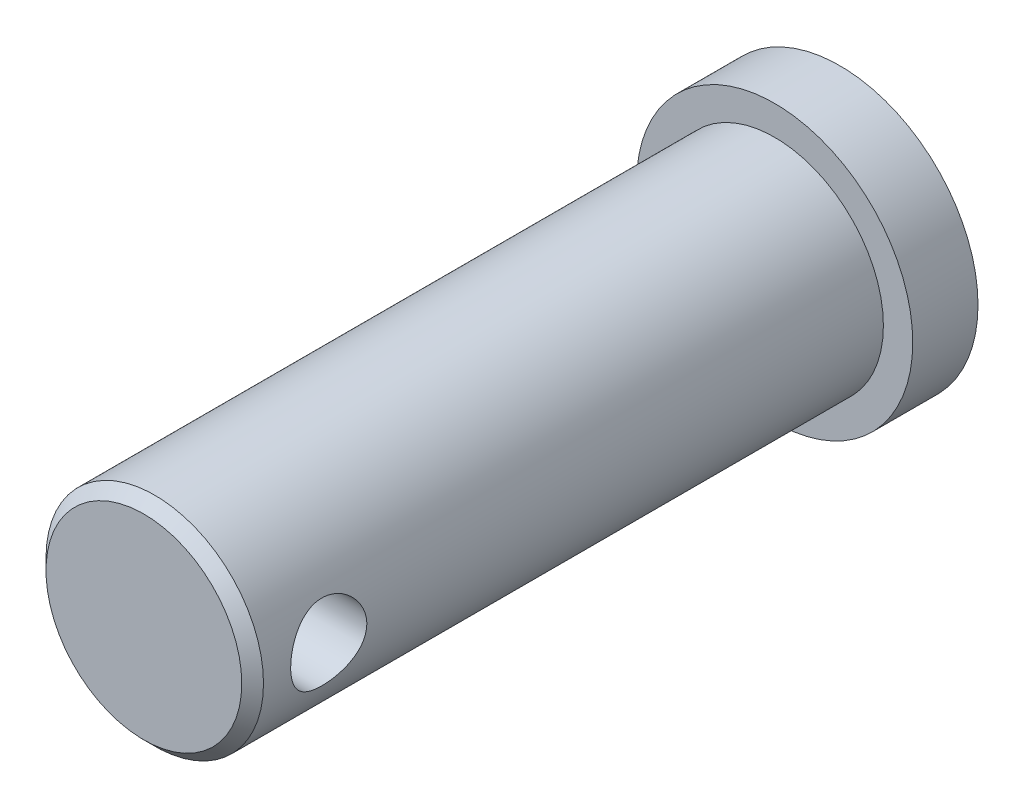
ISO-10303-21;
HEADER;
FILE_DESCRIPTION(('STEP AP214'),'2;1');
FILE_NAME('part.step','',(''),(''),'','','');
FILE_SCHEMA(('AUTOMOTIVE_DESIGN { 1 0 10303 214 1 1 1 1 }'));
ENDSEC;
DATA;
#1=APPLICATION_CONTEXT('core data for automotive mechanical design processes');
#2=APPLICATION_PROTOCOL_DEFINITION('international standard','automotive_design',2000,#1);
#3=PRODUCT_CONTEXT('',#1,'mechanical');
#4=PRODUCT('Part','Part','',(#3));
#5=PRODUCT_RELATED_PRODUCT_CATEGORY('part','',(#4));
#6=PRODUCT_DEFINITION_FORMATION('','',#4);
#7=PRODUCT_DEFINITION_CONTEXT('part definition',#1,'design');
#8=PRODUCT_DEFINITION('design','',#6,#7);
#9=PRODUCT_DEFINITION_SHAPE('','',#8);
#10=(LENGTH_UNIT() NAMED_UNIT(*) SI_UNIT(.MILLI.,.METRE.));
#11=(NAMED_UNIT(*) PLANE_ANGLE_UNIT() SI_UNIT($,.RADIAN.));
#12=(NAMED_UNIT(*) SI_UNIT($,.STERADIAN.) SOLID_ANGLE_UNIT());
#13=UNCERTAINTY_MEASURE_WITH_UNIT(LENGTH_MEASURE(1.E-05),#10,'distance_accuracy_value','');
#14=(GEOMETRIC_REPRESENTATION_CONTEXT(3) GLOBAL_UNCERTAINTY_ASSIGNED_CONTEXT((#13)) GLOBAL_UNIT_ASSIGNED_CONTEXT((#10,
#11,#12)) REPRESENTATION_CONTEXT('',''));
#15=CARTESIAN_POINT('',(0.,0.,0.));
#16=DIRECTION('',(0.,0.,1.));
#17=DIRECTION('',(1.,0.,0.));
#18=AXIS2_PLACEMENT_3D('',#15,#16,#17);
#19=CARTESIAN_POINT('',(0.,0.,29.));
#20=DIRECTION('',(0.,0.,-1.));
#21=DIRECTION('',(-1.,0.,0.));
#22=AXIS2_PLACEMENT_3D('',#19,#20,#21);
#23=CYLINDRICAL_SURFACE('',#22,5.);
#24=CARTESIAN_POINT('',(0.,0.,28.5));
#25=DIRECTION('',(0.,0.,1.));
#26=DIRECTION('',(1.,0.,0.));
#27=AXIS2_PLACEMENT_3D('',#24,#25,#26);
#28=CIRCLE('',#27,5.);
#29=CARTESIAN_POINT('',(5.,0.,28.5));
#30=VERTEX_POINT('',#29);
#31=EDGE_CURVE('E10',#30,#30,#28,.F.);
#32=ORIENTED_EDGE('',*,*,#31,.T.);
#33=EDGE_LOOP('',(#32));
#34=FACE_BOUND('',#33,.T.);
#35=CARTESIAN_POINT('',(-5.,0.,27.25));
#36=CARTESIAN_POINT('',(-5.00000103733101,-0.0952096828338513,27.2500014783247));
#37=CARTESIAN_POINT('',(-4.99725598893572,-0.19040881080287,27.2422051642973));
#38=CARTESIAN_POINT('',(-4.98657727125096,-0.377986679584453,27.2113331034189));
#39=CARTESIAN_POINT('',(-4.97864357880525,-0.470365407808016,27.1882572883774));
#40=CARTESIAN_POINT('',(-4.95844563461182,-0.649571178008045,27.127725530749));
#41=CARTESIAN_POINT('',(-4.94618906431992,-0.736407746879042,27.0902950851138));
#42=CARTESIAN_POINT('',(-4.91858449865725,-0.902568322647419,27.002237444368));
#43=CARTESIAN_POINT('',(-4.90323580073971,-0.981890616231568,26.9516072494384));
#44=CARTESIAN_POINT('',(-4.87040308680158,-1.13376294602663,26.8365857421746));
#45=CARTESIAN_POINT('',(-4.85286420888526,-1.2059909823802,26.7717850408888));
#46=CARTESIAN_POINT('',(-4.81791697471987,-1.3388059257563,26.6311316655263));
#47=CARTESIAN_POINT('',(-4.80050865235984,-1.39938990436505,26.5552762196565));
#48=CARTESIAN_POINT('',(-4.76717677106639,-1.50911478218042,26.3916726752207));
#49=CARTESIAN_POINT('',(-4.75131928060129,-1.5578231653081,26.3036197207704));
#50=CARTESIAN_POINT('',(-4.72372622172788,-1.63959966142256,26.1199277048544));
#51=CARTESIAN_POINT('',(-4.71198924734498,-1.67267311059309,26.024291244662));
#52=CARTESIAN_POINT('',(-4.69454718177247,-1.72100819663792,25.8318284836592));
#53=CARTESIAN_POINT('',(-4.68863691368676,-1.73687783577275,25.7351740514319));
#54=CARTESIAN_POINT('',(-4.68291285938438,-1.75225598886936,25.5404074405401));
#55=CARTESIAN_POINT('',(-4.68309695465922,-1.75177018827031,25.442295780288));
#56=CARTESIAN_POINT('',(-4.68936213420266,-1.73492049950347,25.2527252705587));
#57=CARTESIAN_POINT('',(-4.69514165218839,-1.71936857551242,25.1611825098596));
#58=CARTESIAN_POINT('',(-4.71145002275453,-1.67415954156167,24.9820987968545));
#59=CARTESIAN_POINT('',(-4.72197949914485,-1.64450057890303,24.8945583718371));
#60=CARTESIAN_POINT('',(-4.74680305355679,-1.57142185546169,24.7241938166106));
#61=CARTESIAN_POINT('',(-4.76115899627831,-1.52777332723189,24.6414772243258));
#62=CARTESIAN_POINT('',(-4.79199406442834,-1.4281134425151,24.4842940255076));
#63=CARTESIAN_POINT('',(-4.80847385131419,-1.37209823061347,24.409830002678));
#64=CARTESIAN_POINT('',(-4.84286620656224,-1.24546699759313,24.2667283858153));
#65=CARTESIAN_POINT('',(-4.86080646622104,-1.17419303921033,24.1986783752256));
#66=CARTESIAN_POINT('',(-4.8952687040212,-1.0210284236278,24.0753350640555));
#67=CARTESIAN_POINT('',(-4.91179051664925,-0.939136530251654,24.0200432509147));
#68=CARTESIAN_POINT('',(-4.94181156683104,-0.765717364559242,23.9232470043729));
#69=CARTESIAN_POINT('',(-4.95527243997278,-0.674086901705204,23.8819147187774));
#70=CARTESIAN_POINT('',(-4.97737441176816,-0.484587571487144,23.8154388465667));
#71=CARTESIAN_POINT('',(-4.98601736398459,-0.386721119418452,23.7902890336142));
#72=CARTESIAN_POINT('',(-4.99719530081429,-0.192491021840709,23.7579670932891));
#73=CARTESIAN_POINT('',(-4.99999944582713,-0.0962746493135022,23.7500020967405));
#74=CARTESIAN_POINT('',(-5.00000055348245,0.0961482432192145,23.749997905329));
#75=CARTESIAN_POINT('',(-4.99719857404261,0.192354761658125,23.7579557057149));
#76=CARTESIAN_POINT('',(-4.98648016160199,0.378756147356786,23.7889526749518));
#77=CARTESIAN_POINT('',(-4.97873315412155,0.469044763699441,23.8114925688668));
#78=CARTESIAN_POINT('',(-4.95907295054626,0.644512522088432,23.8703769074503));
#79=CARTESIAN_POINT('',(-4.94715921538899,0.729691001349329,23.9067231383396));
#80=CARTESIAN_POINT('',(-4.91995212643839,0.895153397302999,23.9932950443157));
#81=CARTESIAN_POINT('',(-4.90457436715764,0.975236620637246,24.0438769923518));
#82=CARTESIAN_POINT('',(-4.87216758733509,1.12602889379182,24.1570725897866));
#83=CARTESIAN_POINT('',(-4.85513801945205,1.19673481786299,24.219690234112));
#84=CARTESIAN_POINT('',(-4.82025419862104,1.33047657690196,24.358900100807));
#85=CARTESIAN_POINT('',(-4.80240157790623,1.39294725580894,24.4360370539884));
#86=CARTESIAN_POINT('',(-4.76874589345347,1.50414371312863,24.6000729496999));
#87=CARTESIAN_POINT('',(-4.75294290163694,1.55286900928668,24.6869722345904));
#88=CARTESIAN_POINT('',(-4.72530277474736,1.63505490739624,24.8683336451037));
#89=CARTESIAN_POINT('',(-4.71346572039381,1.66851519866113,24.9627959246092));
#90=CARTESIAN_POINT('',(-4.69533771032375,1.71887583093725,25.1565327269432));
#91=CARTESIAN_POINT('',(-4.68904390901757,1.73578466901695,25.2558047530766));
#92=CARTESIAN_POINT('',(-4.68306030518287,1.75185969647853,25.4503101607711));
#93=CARTESIAN_POINT('',(-4.68301773400572,1.7519736539037,25.5454551483427));
#94=CARTESIAN_POINT('',(-4.68865663417064,1.73682550011427,25.7343313115788));
#95=CARTESIAN_POINT('',(-4.69433769425177,1.72156449363927,25.8280625883318));
#96=CARTESIAN_POINT('',(-4.71050847004451,1.67679826569238,26.0092754793714));
#97=CARTESIAN_POINT('',(-4.72088397271024,1.64763052861044,26.0968514833402));
#98=CARTESIAN_POINT('',(-4.74522244831082,1.57616059789321,26.2659290474035));
#99=CARTESIAN_POINT('',(-4.7591862653351,1.53385531338635,26.3474291724241));
#100=CARTESIAN_POINT('',(-4.78994937845571,1.43498510349303,26.5062172876961));
#101=CARTESIAN_POINT('',(-4.80685142496673,1.37784120361852,26.5831247001007));
#102=CARTESIAN_POINT('',(-4.84118780733322,1.25186200567032,26.7265638143418));
#103=CARTESIAN_POINT('',(-4.85862229965653,1.18302324322024,26.793092430426));
#104=CARTESIAN_POINT('',(-4.8929933476359,1.0319265825184,26.916891890857));
#105=CARTESIAN_POINT('',(-4.90987297784856,0.949206989314115,26.9736172252547));
#106=CARTESIAN_POINT('',(-4.94039013085785,0.774833814541663,27.0723117476398));
#107=CARTESIAN_POINT('',(-4.95402808296839,0.683181418264973,27.1142828899619));
#108=CARTESIAN_POINT('',(-4.97638140508249,0.494514918863301,27.1816286095206));
#109=CARTESIAN_POINT('',(-4.9851485754033,0.397569773126585,27.207178304285));
#110=CARTESIAN_POINT('',(-4.9969563185802,0.200411745802667,27.2413602425026));
#111=CARTESIAN_POINT('',(-4.99999890829805,0.100200027745055,27.24999844419));
#112=CARTESIAN_POINT('',(-5.,0.,27.25));
#113=B_SPLINE_CURVE_WITH_KNOTS('',3,(#35,#36,#37,#38,#39,#40,#41,#42,#43,#44,#45,#46,#47,#48,
#49,#50,#51,#52,#53,#54,#55,#56,#57,#58,#59,#60,#61,#62,#63,#64,#65,#66,#67,#68,#69,#70,#71,#72,
#73,#74,#75,#76,#77,#78,#79,#80,#81,#82,#83,#84,#85,#86,#87,#88,#89,#90,#91,#92,#93,#94,#95,#96,
#97,#98,#99,#100,#101,#102,#103,#104,#105,#106,#107,#108,#109,#110,#111,#112),.UNSPECIFIED.,.T.,
.F.,(4,2,2,2,2,2,2,2,2,2,2,2,2,2,2,2,2,2,2,2,2,2,2,2,2,2,2,2,2,2,2,2,2,2,2,2,2,2,4),(0.,
0.285259972015708,0.570521217118272,0.855278105441004,1.14009976506063,1.43460645051474,
1.72918710607093,2.03327692240217,2.33726287818893,2.63011516958153,2.92286566140676,
3.20066900267534,3.4785088383591,3.76114618999298,4.0438717808712,4.34297890688594,
4.64212088729939,4.94482757119952,5.24741771649683,5.535718777151,5.82396543836598,
6.10283068551593,6.38173202367696,6.66835188854305,6.95506705399024,7.25621287816635,
7.55736926668414,7.85853178432477,8.15953961206051,8.44355407895973,8.72754813997991,
9.00497624679231,9.28246967364509,9.57306535444325,9.86374726916318,10.1673989020176,
10.4710102981225,10.7713277865075,11.0715394483866),.UNSPECIFIED.);
#114=CARTESIAN_POINT('',(-5.,0.,27.25));
#115=VERTEX_POINT('',#114);
#116=EDGE_CURVE('E48',#115,#115,#113,.T.);
#117=ORIENTED_EDGE('',*,*,#116,.T.);
#118=EDGE_LOOP('',(#117));
#119=FACE_BOUND('',#118,.T.);
#120=CARTESIAN_POINT('',(5.,0.,23.75));
#121=CARTESIAN_POINT('',(5.00000103733102,-0.0952096828338514,23.7499985216753));
#122=CARTESIAN_POINT('',(4.99725598893573,-0.19040881080287,23.7577948357027));
#123=CARTESIAN_POINT('',(4.98657727125096,-0.377986679584453,23.7886668965811));
#124=CARTESIAN_POINT('',(4.97864357880525,-0.470365407808016,23.8117427116226));
#125=CARTESIAN_POINT('',(4.95844563461182,-0.649571178008045,23.872274469251));
#126=CARTESIAN_POINT('',(4.94618906431992,-0.736407746879042,23.9097049148862));
#127=CARTESIAN_POINT('',(4.91858449865725,-0.902568322647419,23.997762555632));
#128=CARTESIAN_POINT('',(4.90323580073971,-0.981890616231568,24.0483927505616));
#129=CARTESIAN_POINT('',(4.87040308680158,-1.13376294602663,24.1634142578254));
#130=CARTESIAN_POINT('',(4.85286420888526,-1.2059909823802,24.2282149591112));
#131=CARTESIAN_POINT('',(4.81791697471987,-1.3388059257563,24.3688683344737));
#132=CARTESIAN_POINT('',(4.80050865235984,-1.39938990436505,24.4447237803435));
#133=CARTESIAN_POINT('',(4.76717677106639,-1.50911478218042,24.6083273247793));
#134=CARTESIAN_POINT('',(4.75131928060129,-1.5578231653081,24.6963802792296));
#135=CARTESIAN_POINT('',(4.72372622172788,-1.63959966142256,24.8800722951456));
#136=CARTESIAN_POINT('',(4.71198924734498,-1.67267311059309,24.975708755338));
#137=CARTESIAN_POINT('',(4.69454718177247,-1.72100819663792,25.1681715163408));
#138=CARTESIAN_POINT('',(4.68863691368676,-1.73687783577275,25.2648259485681));
#139=CARTESIAN_POINT('',(4.68291285938438,-1.75225598886936,25.4595925594599));
#140=CARTESIAN_POINT('',(4.68309695465922,-1.75177018827031,25.557704219712));
#141=CARTESIAN_POINT('',(4.68936213420266,-1.73492049950347,25.7472747294413));
#142=CARTESIAN_POINT('',(4.69514165218839,-1.71936857551242,25.8388174901404));
#143=CARTESIAN_POINT('',(4.71145002275453,-1.67415954156167,26.0179012031455));
#144=CARTESIAN_POINT('',(4.72197949914485,-1.64450057890303,26.1054416281629));
#145=CARTESIAN_POINT('',(4.74680305355679,-1.57142185546169,26.2758061833894));
#146=CARTESIAN_POINT('',(4.76115899627832,-1.52777332723189,26.3585227756742));
#147=CARTESIAN_POINT('',(4.79199406442834,-1.4281134425151,26.5157059744924));
#148=CARTESIAN_POINT('',(4.80847385131419,-1.37209823061347,26.590169997322));
#149=CARTESIAN_POINT('',(4.84286620656224,-1.24546699759313,26.7332716141847));
#150=CARTESIAN_POINT('',(4.86080646622104,-1.17419303921033,26.8013216247744));
#151=CARTESIAN_POINT('',(4.8952687040212,-1.0210284236278,26.9246649359445));
#152=CARTESIAN_POINT('',(4.91179051664925,-0.939136530251654,26.9799567490853));
#153=CARTESIAN_POINT('',(4.94181156683104,-0.765717364559242,27.0767529956271));
#154=CARTESIAN_POINT('',(4.95527243997278,-0.674086901705204,27.1180852812226));
#155=CARTESIAN_POINT('',(4.97737441176816,-0.484587571487144,27.1845611534332));
#156=CARTESIAN_POINT('',(4.98601736398459,-0.386721119418453,27.2097109663858));
#157=CARTESIAN_POINT('',(4.99719530081429,-0.19249102184071,27.2420329067109));
#158=CARTESIAN_POINT('',(4.99999944582713,-0.0962746493135025,27.2499979032595));
#159=CARTESIAN_POINT('',(5.00000055348245,0.0961482432192139,27.250002094671));
#160=CARTESIAN_POINT('',(4.99719857404261,0.192354761658124,27.2420442942851));
#161=CARTESIAN_POINT('',(4.98648016160199,0.378756147356785,27.2110473250482));
#162=CARTESIAN_POINT('',(4.97873315412155,0.46904476369944,27.1885074311332));
#163=CARTESIAN_POINT('',(4.95907295054626,0.644512522088431,27.1296230925497));
#164=CARTESIAN_POINT('',(4.94715921538899,0.729691001349328,27.0932768616604));
#165=CARTESIAN_POINT('',(4.91995212643839,0.895153397302998,27.0067049556843));
#166=CARTESIAN_POINT('',(4.90457436715764,0.975236620637246,26.9561230076482));
#167=CARTESIAN_POINT('',(4.87216758733509,1.12602889379182,26.8429274102134));
#168=CARTESIAN_POINT('',(4.85513801945205,1.19673481786299,26.780309765888));
#169=CARTESIAN_POINT('',(4.82025419862104,1.33047657690196,26.641099899193));
#170=CARTESIAN_POINT('',(4.80240157790623,1.39294725580895,26.5639629460116));
#171=CARTESIAN_POINT('',(4.76874589345347,1.50414371312864,26.3999270503001));
#172=CARTESIAN_POINT('',(4.75294290163694,1.55286900928668,26.3130277654096));
#173=CARTESIAN_POINT('',(4.72530277474736,1.63505490739624,26.1316663548963));
#174=CARTESIAN_POINT('',(4.71346572039381,1.66851519866113,26.0372040753908));
#175=CARTESIAN_POINT('',(4.69533771032375,1.71887583093725,25.8434672730568));
#176=CARTESIAN_POINT('',(4.68904390901757,1.73578466901695,25.7441952469234));
#177=CARTESIAN_POINT('',(4.68306030518287,1.75185969647853,25.5496898392289));
#178=CARTESIAN_POINT('',(4.68301773400572,1.7519736539037,25.4545448516573));
#179=CARTESIAN_POINT('',(4.68865663417064,1.73682550011427,25.2656686884212));
#180=CARTESIAN_POINT('',(4.69433769425177,1.72156449363927,25.1719374116682));
#181=CARTESIAN_POINT('',(4.71050847004451,1.67679826569238,24.9907245206286));
#182=CARTESIAN_POINT('',(4.72088397271024,1.64763052861044,24.9031485166598));
#183=CARTESIAN_POINT('',(4.74522244831082,1.57616059789321,24.7340709525965));
#184=CARTESIAN_POINT('',(4.7591862653351,1.53385531338635,24.6525708275759));
#185=CARTESIAN_POINT('',(4.78994937845571,1.43498510349303,24.4937827123039));
#186=CARTESIAN_POINT('',(4.80685142496673,1.37784120361852,24.4168752998993));
#187=CARTESIAN_POINT('',(4.84118780733322,1.25186200567033,24.2734361856582));
#188=CARTESIAN_POINT('',(4.85862229965653,1.18302324322024,24.206907569574));
#189=CARTESIAN_POINT('',(4.8929933476359,1.03192658251841,24.083108109143));
#190=CARTESIAN_POINT('',(4.90987297784856,0.949206989314118,24.0263827747453));
#191=CARTESIAN_POINT('',(4.94039013085785,0.774833814541665,23.9276882523602));
#192=CARTESIAN_POINT('',(4.95402808296839,0.683181418264975,23.8857171100381));
#193=CARTESIAN_POINT('',(4.97638140508249,0.494514918863301,23.8183713904794));
#194=CARTESIAN_POINT('',(4.9851485754033,0.397569773126585,23.792821695715));
#195=CARTESIAN_POINT('',(4.9969563185802,0.200411745802666,23.7586397574974));
#196=CARTESIAN_POINT('',(4.99999890829805,0.100200027745055,23.75000155581));
#197=CARTESIAN_POINT('',(5.,0.,23.75));
#198=B_SPLINE_CURVE_WITH_KNOTS('',3,(#120,#121,#122,#123,#124,#125,#126,#127,#128,#129,#130,
#131,#132,#133,#134,#135,#136,#137,#138,#139,#140,#141,#142,#143,#144,#145,#146,#147,#148,#149,
#150,#151,#152,#153,#154,#155,#156,#157,#158,#159,#160,#161,#162,#163,#164,#165,#166,#167,#168,
#169,#170,#171,#172,#173,#174,#175,#176,#177,#178,#179,#180,#181,#182,#183,#184,#185,#186,#187,
#188,#189,#190,#191,#192,#193,#194,#195,#196,#197),.UNSPECIFIED.,.T.,.F.,(4,2,2,2,2,2,2,2,2,2,2,
2,2,2,2,2,2,2,2,2,2,2,2,2,2,2,2,2,2,2,2,2,2,2,2,2,2,2,4),(0.,0.285259972015708,
0.570521217118272,0.855278105441005,1.14009976506063,1.43460645051474,1.72918710607093,
2.03327692240217,2.33726287818893,2.63011516958154,2.92286566140676,3.20066900267534,
3.4785088383591,3.76114618999299,4.0438717808712,4.34297890688594,4.64212088729939,
4.94482757119952,5.24741771649683,5.535718777151,5.82396543836598,6.10283068551593,
6.38173202367696,6.66835188854305,6.95506705399024,7.25621287816635,7.55736926668414,
7.85853178432477,8.15953961206051,8.44355407895973,8.7275481399799,9.0049762467923,
9.28246967364509,9.57306535444324,9.86374726916317,10.1673989020176,10.4710102981225,
10.7713277865075,11.0715394483866),.UNSPECIFIED.);
#199=CARTESIAN_POINT('',(5.,0.,23.75));
#200=VERTEX_POINT('',#199);
#201=EDGE_CURVE('E55',#200,#200,#198,.T.);
#202=ORIENTED_EDGE('',*,*,#201,.T.);
#203=EDGE_LOOP('',(#202));
#204=FACE_BOUND('',#203,.T.);
#205=CARTESIAN_POINT('',(0.,0.,0.));
#206=DIRECTION('',(0.,0.,1.));
#207=DIRECTION('',(1.,0.,0.));
#208=AXIS2_PLACEMENT_3D('',#205,#206,#207);
#209=CIRCLE('',#208,5.);
#210=CARTESIAN_POINT('',(5.,0.,0.));
#211=VERTEX_POINT('',#210);
#212=EDGE_CURVE('E41',#211,#211,#209,.T.);
#213=ORIENTED_EDGE('',*,*,#212,.T.);
#214=EDGE_LOOP('',(#213));
#215=FACE_BOUND('',#214,.T.);
#216=ADVANCED_FACE('F30',(#34,#119,#204,#215),#23,.T.);
#217=CARTESIAN_POINT('',(0.,-14.1114213562373,29.));
#218=DIRECTION('',(0.,0.,1.));
#219=DIRECTION('',(1.,0.,0.));
#220=AXIS2_PLACEMENT_3D('',#217,#218,#219);
#221=PLANE('',#220);
#222=CARTESIAN_POINT('',(0.,0.,29.));
#223=DIRECTION('',(0.,0.,1.));
#224=DIRECTION('',(1.,0.,0.));
#225=AXIS2_PLACEMENT_3D('',#222,#223,#224);
#226=CIRCLE('',#225,4.50000000000002);
#227=CARTESIAN_POINT('',(4.50000000000002,0.,29.));
#228=VERTEX_POINT('',#227);
#229=EDGE_CURVE('E37',#228,#228,#226,.T.);
#230=ORIENTED_EDGE('',*,*,#229,.T.);
#231=EDGE_LOOP('',(#230));
#232=FACE_BOUND('',#231,.T.);
#233=ADVANCED_FACE('F74',(#232),#221,.T.);
#234=CARTESIAN_POINT('',(0.,0.,0.));
#235=DIRECTION('',(0.,0.,1.));
#236=DIRECTION('',(1.,0.,0.));
#237=AXIS2_PLACEMENT_3D('',#234,#235,#236);
#238=PLANE('',#237);
#239=CARTESIAN_POINT('',(0.,0.,0.));
#240=DIRECTION('',(0.,0.,1.));
#241=DIRECTION('',(1.,0.,0.));
#242=AXIS2_PLACEMENT_3D('',#239,#240,#241);
#243=CIRCLE('',#242,6.35);
#244=CARTESIAN_POINT('',(6.35,0.,0.));
#245=VERTEX_POINT('',#244);
#246=EDGE_CURVE('E54',#245,#245,#243,.T.);
#247=ORIENTED_EDGE('',*,*,#246,.T.);
#248=EDGE_LOOP('',(#247));
#249=FACE_BOUND('',#248,.T.);
#250=ORIENTED_EDGE('',*,*,#212,.F.);
#251=EDGE_LOOP('',(#250));
#252=FACE_BOUND('',#251,.T.);
#253=ADVANCED_FACE('F71',(#249,#252),#238,.T.);
#254=CARTESIAN_POINT('',(0.,0.,-3.));
#255=DIRECTION('',(0.,0.,1.));
#256=DIRECTION('',(1.,0.,0.));
#257=AXIS2_PLACEMENT_3D('',#254,#255,#256);
#258=CYLINDRICAL_SURFACE('',#257,6.35);
#259=CARTESIAN_POINT('',(0.,0.,-3.));
#260=DIRECTION('',(0.,0.,1.));
#261=DIRECTION('',(1.,0.,0.));
#262=AXIS2_PLACEMENT_3D('',#259,#260,#261);
#263=CIRCLE('',#262,6.35);
#264=CARTESIAN_POINT('',(6.35,0.,-3.));
#265=VERTEX_POINT('',#264);
#266=EDGE_CURVE('E45',#265,#265,#263,.T.);
#267=ORIENTED_EDGE('',*,*,#266,.T.);
#268=EDGE_LOOP('',(#267));
#269=FACE_BOUND('',#268,.T.);
#270=ORIENTED_EDGE('',*,*,#246,.F.);
#271=EDGE_LOOP('',(#270));
#272=FACE_BOUND('',#271,.T.);
#273=ADVANCED_FACE('F69',(#269,#272),#258,.T.);
#274=CARTESIAN_POINT('',(0.,0.,-3.));
#275=DIRECTION('',(0.,0.,1.));
#276=DIRECTION('',(1.,0.,0.));
#277=AXIS2_PLACEMENT_3D('',#274,#275,#276);
#278=PLANE('',#277);
#279=ORIENTED_EDGE('',*,*,#266,.F.);
#280=EDGE_LOOP('',(#279));
#281=FACE_BOUND('',#280,.T.);
#282=ADVANCED_FACE('F64',(#281),#278,.F.);
#283=CARTESIAN_POINT('',(-7.5,0.,25.5));
#284=DIRECTION('',(1.,0.,0.));
#285=DIRECTION('',(0.,0.,-1.));
#286=AXIS2_PLACEMENT_3D('',#283,#284,#285);
#287=CYLINDRICAL_SURFACE('',#286,1.75);
#288=ORIENTED_EDGE('',*,*,#201,.F.);
#289=EDGE_LOOP('',(#288));
#290=FACE_BOUND('',#289,.T.);
#291=ORIENTED_EDGE('',*,*,#116,.F.);
#292=EDGE_LOOP('',(#291));
#293=FACE_BOUND('',#292,.T.);
#294=ADVANCED_FACE('F60',(#290,#293),#287,.F.);
#295=CARTESIAN_POINT('',(0.,0.,29.));
#296=DIRECTION('',(0.,0.,-1.));
#297=DIRECTION('',(-1.,0.,0.));
#298=AXIS2_PLACEMENT_3D('',#295,#296,#297);
#299=CONICAL_SURFACE('',#298,4.50000000000002,0.785398163397447);
#300=ORIENTED_EDGE('',*,*,#31,.F.);
#301=EDGE_LOOP('',(#300));
#302=FACE_BOUND('',#301,.T.);
#303=ORIENTED_EDGE('',*,*,#229,.F.);
#304=EDGE_LOOP('',(#303));
#305=FACE_BOUND('',#304,.T.);
#306=ADVANCED_FACE('F32',(#302,#305),#299,.T.);
#307=CLOSED_SHELL('',(#216,#233,#253,#273,#282,#294,#306));
#308=MANIFOLD_SOLID_BREP('B2',#307);
#309=ADVANCED_BREP_SHAPE_REPRESENTATION('',(#18,#308),#14);
#310=SHAPE_DEFINITION_REPRESENTATION(#9,#309);
ENDSEC;
END-ISO-10303-21;
